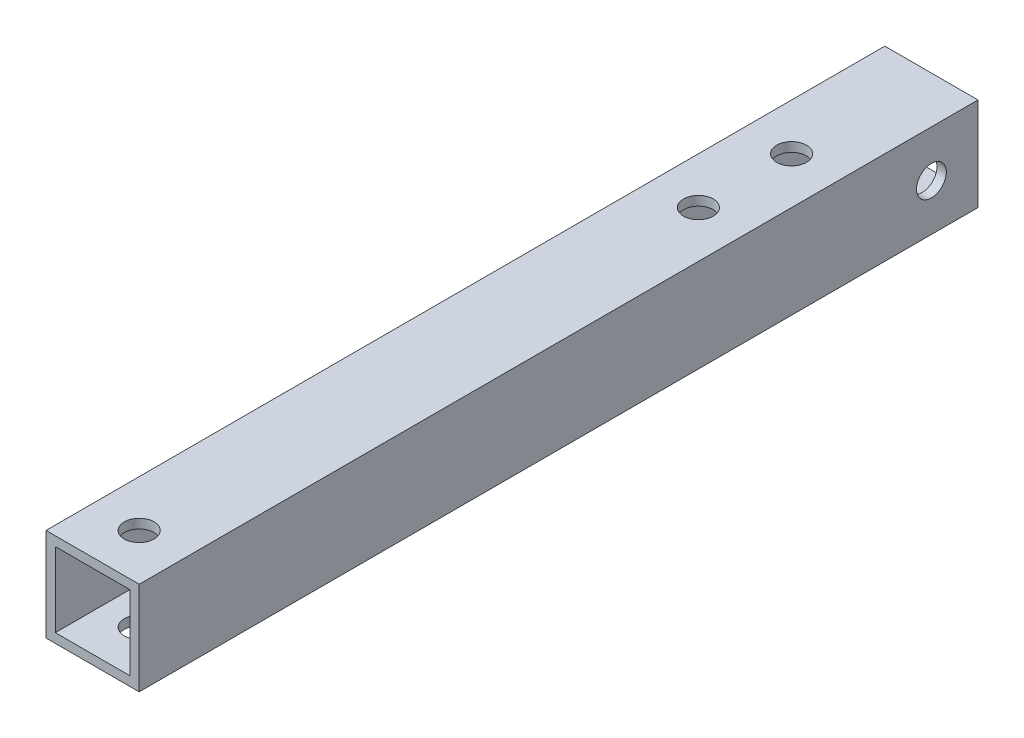
ISO-10303-21;
HEADER;
FILE_DESCRIPTION(('STEP AP214'),'2;1');
FILE_NAME('part.step','',(''),(''),'','','');
FILE_SCHEMA(('AUTOMOTIVE_DESIGN { 1 0 10303 214 1 1 1 1 }'));
ENDSEC;
DATA;
#1=APPLICATION_CONTEXT('core data for automotive mechanical design processes');
#2=APPLICATION_PROTOCOL_DEFINITION('international standard','automotive_design',2000,#1);
#3=PRODUCT_CONTEXT('',#1,'mechanical');
#4=PRODUCT('Part','Part','',(#3));
#5=PRODUCT_RELATED_PRODUCT_CATEGORY('part','',(#4));
#6=PRODUCT_DEFINITION_FORMATION('','',#4);
#7=PRODUCT_DEFINITION_CONTEXT('part definition',#1,'design');
#8=PRODUCT_DEFINITION('design','',#6,#7);
#9=PRODUCT_DEFINITION_SHAPE('','',#8);
#10=(LENGTH_UNIT() NAMED_UNIT(*) SI_UNIT(.MILLI.,.METRE.));
#11=(NAMED_UNIT(*) PLANE_ANGLE_UNIT() SI_UNIT($,.RADIAN.));
#12=(NAMED_UNIT(*) SI_UNIT($,.STERADIAN.) SOLID_ANGLE_UNIT());
#13=UNCERTAINTY_MEASURE_WITH_UNIT(LENGTH_MEASURE(1.E-05),#10,'distance_accuracy_value','');
#14=(GEOMETRIC_REPRESENTATION_CONTEXT(3) GLOBAL_UNCERTAINTY_ASSIGNED_CONTEXT((#13)) GLOBAL_UNIT_ASSIGNED_CONTEXT((#10,
#11,#12)) REPRESENTATION_CONTEXT('',''));
#15=CARTESIAN_POINT('',(0.,0.,0.));
#16=DIRECTION('',(0.,0.,1.));
#17=DIRECTION('',(1.,0.,0.));
#18=AXIS2_PLACEMENT_3D('',#15,#16,#17);
#19=CARTESIAN_POINT('',(0.,0.,90.));
#20=DIRECTION('',(0.,0.,1.));
#21=DIRECTION('',(1.,0.,0.));
#22=AXIS2_PLACEMENT_3D('',#19,#20,#21);
#23=PLANE('',#22);
#24=DIRECTION('',(0.,-1.,0.));
#25=VECTOR('',#24,1.);
#26=CARTESIAN_POINT('',(-5.,-5.,90.));
#27=LINE('',#26,#25);
#28=CARTESIAN_POINT('',(-5.,5.,90.));
#29=VERTEX_POINT('',#28);
#30=CARTESIAN_POINT('',(-5.,-5.,90.));
#31=VERTEX_POINT('',#30);
#32=EDGE_CURVE('E138',#29,#31,#27,.T.);
#33=ORIENTED_EDGE('',*,*,#32,.T.);
#34=DIRECTION('',(1.,0.,0.));
#35=VECTOR('',#34,1.);
#36=CARTESIAN_POINT('',(5.,-5.,90.));
#37=LINE('',#36,#35);
#38=CARTESIAN_POINT('',(5.,-5.,90.));
#39=VERTEX_POINT('',#38);
#40=EDGE_CURVE('E141',#31,#39,#37,.T.);
#41=ORIENTED_EDGE('',*,*,#40,.T.);
#42=DIRECTION('',(0.,1.,0.));
#43=VECTOR('',#42,1.);
#44=CARTESIAN_POINT('',(5.,-5.,90.));
#45=LINE('',#44,#43);
#46=CARTESIAN_POINT('',(5.,5.,90.));
#47=VERTEX_POINT('',#46);
#48=EDGE_CURVE('E144',#39,#47,#45,.T.);
#49=ORIENTED_EDGE('',*,*,#48,.T.);
#50=DIRECTION('',(-1.,0.,0.));
#51=VECTOR('',#50,1.);
#52=CARTESIAN_POINT('',(5.,5.,90.));
#53=LINE('',#52,#51);
#54=EDGE_CURVE('E146',#47,#29,#53,.T.);
#55=ORIENTED_EDGE('',*,*,#54,.T.);
#56=EDGE_LOOP('',(#33,#41,#49,#55));
#57=FACE_BOUND('',#56,.T.);
#58=DIRECTION('',(1.,0.,0.));
#59=VECTOR('',#58,1.);
#60=CARTESIAN_POINT('',(4.,-4.,90.));
#61=LINE('',#60,#59);
#62=CARTESIAN_POINT('',(-4.,-4.,90.));
#63=VERTEX_POINT('',#62);
#64=CARTESIAN_POINT('',(4.,-4.,90.));
#65=VERTEX_POINT('',#64);
#66=EDGE_CURVE('E108',#63,#65,#61,.T.);
#67=ORIENTED_EDGE('',*,*,#66,.F.);
#68=DIRECTION('',(0.,-1.,0.));
#69=VECTOR('',#68,1.);
#70=CARTESIAN_POINT('',(-4.,-4.,90.));
#71=LINE('',#70,#69);
#72=CARTESIAN_POINT('',(-4.,4.,90.));
#73=VERTEX_POINT('',#72);
#74=EDGE_CURVE('E100',#73,#63,#71,.T.);
#75=ORIENTED_EDGE('',*,*,#74,.F.);
#76=DIRECTION('',(-1.,0.,0.));
#77=VECTOR('',#76,1.);
#78=CARTESIAN_POINT('',(4.,4.,90.));
#79=LINE('',#78,#77);
#80=CARTESIAN_POINT('',(4.,4.,90.));
#81=VERTEX_POINT('',#80);
#82=EDGE_CURVE('E122',#81,#73,#79,.T.);
#83=ORIENTED_EDGE('',*,*,#82,.F.);
#84=DIRECTION('',(0.,1.,0.));
#85=VECTOR('',#84,1.);
#86=CARTESIAN_POINT('',(4.,-4.,90.));
#87=LINE('',#86,#85);
#88=EDGE_CURVE('E120',#65,#81,#87,.T.);
#89=ORIENTED_EDGE('',*,*,#88,.F.);
#90=EDGE_LOOP('',(#67,#75,#83,#89));
#91=FACE_BOUND('',#90,.T.);
#92=ADVANCED_FACE('F33',(#57,#91),#23,.T.);
#93=CARTESIAN_POINT('',(0.,0.,0.));
#94=DIRECTION('',(0.,0.,1.));
#95=DIRECTION('',(1.,0.,0.));
#96=AXIS2_PLACEMENT_3D('',#93,#94,#95);
#97=PLANE('',#96);
#98=DIRECTION('',(0.,-1.,0.));
#99=VECTOR('',#98,1.);
#100=CARTESIAN_POINT('',(-5.,-5.,0.));
#101=LINE('',#100,#99);
#102=CARTESIAN_POINT('',(-5.,5.,0.));
#103=VERTEX_POINT('',#102);
#104=CARTESIAN_POINT('',(-5.,-5.,0.));
#105=VERTEX_POINT('',#104);
#106=EDGE_CURVE('E116',#103,#105,#101,.T.);
#107=ORIENTED_EDGE('',*,*,#106,.F.);
#108=DIRECTION('',(-1.,0.,0.));
#109=VECTOR('',#108,1.);
#110=CARTESIAN_POINT('',(5.,5.,0.));
#111=LINE('',#110,#109);
#112=CARTESIAN_POINT('',(5.,5.,0.));
#113=VERTEX_POINT('',#112);
#114=EDGE_CURVE('E142',#113,#103,#111,.T.);
#115=ORIENTED_EDGE('',*,*,#114,.F.);
#116=DIRECTION('',(0.,1.,0.));
#117=VECTOR('',#116,1.);
#118=CARTESIAN_POINT('',(5.,-5.,0.));
#119=LINE('',#118,#117);
#120=CARTESIAN_POINT('',(5.,-5.,0.));
#121=VERTEX_POINT('',#120);
#122=EDGE_CURVE('E153',#121,#113,#119,.T.);
#123=ORIENTED_EDGE('',*,*,#122,.F.);
#124=DIRECTION('',(1.,0.,0.));
#125=VECTOR('',#124,1.);
#126=CARTESIAN_POINT('',(5.,-5.,0.));
#127=LINE('',#126,#125);
#128=EDGE_CURVE('E151',#105,#121,#127,.T.);
#129=ORIENTED_EDGE('',*,*,#128,.F.);
#130=EDGE_LOOP('',(#107,#115,#123,#129));
#131=FACE_BOUND('',#130,.T.);
#132=DIRECTION('',(0.,-1.,0.));
#133=VECTOR('',#132,1.);
#134=CARTESIAN_POINT('',(-4.,-4.,0.));
#135=LINE('',#134,#133);
#136=CARTESIAN_POINT('',(-4.,4.,0.));
#137=VERTEX_POINT('',#136);
#138=CARTESIAN_POINT('',(-4.,-4.,0.));
#139=VERTEX_POINT('',#138);
#140=EDGE_CURVE('E58',#137,#139,#135,.T.);
#141=ORIENTED_EDGE('',*,*,#140,.T.);
#142=DIRECTION('',(1.,0.,0.));
#143=VECTOR('',#142,1.);
#144=CARTESIAN_POINT('',(4.,-4.,0.));
#145=LINE('',#144,#143);
#146=CARTESIAN_POINT('',(4.,-4.,0.));
#147=VERTEX_POINT('',#146);
#148=EDGE_CURVE('E115',#139,#147,#145,.T.);
#149=ORIENTED_EDGE('',*,*,#148,.T.);
#150=DIRECTION('',(0.,1.,0.));
#151=VECTOR('',#150,1.);
#152=CARTESIAN_POINT('',(4.,-4.,0.));
#153=LINE('',#152,#151);
#154=CARTESIAN_POINT('',(4.,4.,0.));
#155=VERTEX_POINT('',#154);
#156=EDGE_CURVE('E130',#147,#155,#153,.T.);
#157=ORIENTED_EDGE('',*,*,#156,.T.);
#158=DIRECTION('',(-1.,0.,0.));
#159=VECTOR('',#158,1.);
#160=CARTESIAN_POINT('',(4.,4.,0.));
#161=LINE('',#160,#159);
#162=EDGE_CURVE('E109',#155,#137,#161,.T.);
#163=ORIENTED_EDGE('',*,*,#162,.T.);
#164=EDGE_LOOP('',(#141,#149,#157,#163));
#165=FACE_BOUND('',#164,.T.);
#166=ADVANCED_FACE('F222',(#131,#165),#97,.F.);
#167=CARTESIAN_POINT('',(-5.,-5.,90.));
#168=DIRECTION('',(1.,0.,0.));
#169=DIRECTION('',(0.,0.,-1.));
#170=AXIS2_PLACEMENT_3D('',#167,#168,#169);
#171=PLANE('',#170);
#172=CARTESIAN_POINT('',(-5.,0.,5.));
#173=DIRECTION('',(1.,0.,0.));
#174=DIRECTION('',(0.,0.,-1.));
#175=AXIS2_PLACEMENT_3D('',#172,#173,#174);
#176=CIRCLE('',#175,1.6);
#177=CARTESIAN_POINT('',(-5.,0.,3.4));
#178=VERTEX_POINT('',#177);
#179=EDGE_CURVE('E187',#178,#178,#176,.T.);
#180=ORIENTED_EDGE('',*,*,#179,.T.);
#181=EDGE_LOOP('',(#180));
#182=FACE_BOUND('',#181,.T.);
#183=ORIENTED_EDGE('',*,*,#106,.T.);
#184=DIRECTION('',(0.,0.,-1.));
#185=VECTOR('',#184,1.);
#186=CARTESIAN_POINT('',(-5.,-5.,90.));
#187=LINE('',#186,#185);
#188=EDGE_CURVE('E11',#31,#105,#187,.T.);
#189=ORIENTED_EDGE('',*,*,#188,.F.);
#190=ORIENTED_EDGE('',*,*,#32,.F.);
#191=DIRECTION('',(0.,0.,-1.));
#192=VECTOR('',#191,1.);
#193=CARTESIAN_POINT('',(-5.,5.,90.));
#194=LINE('',#193,#192);
#195=EDGE_CURVE('E148',#29,#103,#194,.T.);
#196=ORIENTED_EDGE('',*,*,#195,.T.);
#197=EDGE_LOOP('',(#183,#189,#190,#196));
#198=FACE_BOUND('',#197,.T.);
#199=ADVANCED_FACE('F35',(#182,#198),#171,.F.);
#200=CARTESIAN_POINT('',(5.,-5.,90.));
#201=DIRECTION('',(0.,1.,0.));
#202=DIRECTION('',(0.,0.,1.));
#203=AXIS2_PLACEMENT_3D('',#200,#201,#202);
#204=PLANE('',#203);
#205=CARTESIAN_POINT('',(0.,-5.,15.));
#206=DIRECTION('',(0.,1.,0.));
#207=DIRECTION('',(-1.,0.,0.));
#208=AXIS2_PLACEMENT_3D('',#205,#206,#207);
#209=CIRCLE('',#208,1.6);
#210=CARTESIAN_POINT('',(-1.6,-5.,15.));
#211=VERTEX_POINT('',#210);
#212=EDGE_CURVE('E167',#211,#211,#209,.T.);
#213=ORIENTED_EDGE('',*,*,#212,.T.);
#214=EDGE_LOOP('',(#213));
#215=FACE_BOUND('',#214,.T.);
#216=CARTESIAN_POINT('',(0.,-5.,85.));
#217=DIRECTION('',(0.,1.,0.));
#218=DIRECTION('',(-1.,0.,0.));
#219=AXIS2_PLACEMENT_3D('',#216,#217,#218);
#220=CIRCLE('',#219,1.6);
#221=CARTESIAN_POINT('',(-1.6,-5.,85.));
#222=VERTEX_POINT('',#221);
#223=EDGE_CURVE('E193',#222,#222,#220,.T.);
#224=ORIENTED_EDGE('',*,*,#223,.T.);
#225=EDGE_LOOP('',(#224));
#226=FACE_BOUND('',#225,.T.);
#227=CARTESIAN_POINT('',(0.,-5.,25.));
#228=DIRECTION('',(0.,1.,0.));
#229=DIRECTION('',(-1.,0.,0.));
#230=AXIS2_PLACEMENT_3D('',#227,#228,#229);
#231=CIRCLE('',#230,1.6);
#232=CARTESIAN_POINT('',(-1.6,-5.,25.));
#233=VERTEX_POINT('',#232);
#234=EDGE_CURVE('E186',#233,#233,#231,.T.);
#235=ORIENTED_EDGE('',*,*,#234,.T.);
#236=EDGE_LOOP('',(#235));
#237=FACE_BOUND('',#236,.T.);
#238=ORIENTED_EDGE('',*,*,#128,.T.);
#239=DIRECTION('',(0.,0.,-1.));
#240=VECTOR('',#239,1.);
#241=CARTESIAN_POINT('',(5.,-5.,90.));
#242=LINE('',#241,#240);
#243=EDGE_CURVE('E42',#39,#121,#242,.T.);
#244=ORIENTED_EDGE('',*,*,#243,.F.);
#245=ORIENTED_EDGE('',*,*,#40,.F.);
#246=ORIENTED_EDGE('',*,*,#188,.T.);
#247=EDGE_LOOP('',(#238,#244,#245,#246));
#248=FACE_BOUND('',#247,.T.);
#249=ADVANCED_FACE('F252',(#215,#226,#237,#248),#204,.F.);
#250=CARTESIAN_POINT('',(5.,-5.,90.));
#251=DIRECTION('',(-1.,0.,0.));
#252=DIRECTION('',(0.,0.,1.));
#253=AXIS2_PLACEMENT_3D('',#250,#251,#252);
#254=PLANE('',#253);
#255=CARTESIAN_POINT('',(5.,0.,5.));
#256=DIRECTION('',(1.,0.,0.));
#257=DIRECTION('',(0.,0.,-1.));
#258=AXIS2_PLACEMENT_3D('',#255,#256,#257);
#259=CIRCLE('',#258,1.6);
#260=CARTESIAN_POINT('',(5.,0.,3.4));
#261=VERTEX_POINT('',#260);
#262=EDGE_CURVE('E206',#261,#261,#259,.T.);
#263=ORIENTED_EDGE('',*,*,#262,.F.);
#264=EDGE_LOOP('',(#263));
#265=FACE_BOUND('',#264,.T.);
#266=ORIENTED_EDGE('',*,*,#122,.T.);
#267=DIRECTION('',(0.,0.,-1.));
#268=VECTOR('',#267,1.);
#269=CARTESIAN_POINT('',(5.,5.,90.));
#270=LINE('',#269,#268);
#271=EDGE_CURVE('E158',#47,#113,#270,.T.);
#272=ORIENTED_EDGE('',*,*,#271,.F.);
#273=ORIENTED_EDGE('',*,*,#48,.F.);
#274=ORIENTED_EDGE('',*,*,#243,.T.);
#275=EDGE_LOOP('',(#266,#272,#273,#274));
#276=FACE_BOUND('',#275,.T.);
#277=ADVANCED_FACE('F249',(#265,#276),#254,.F.);
#278=CARTESIAN_POINT('',(5.,5.,90.));
#279=DIRECTION('',(0.,-1.,0.));
#280=DIRECTION('',(1.,0.,0.));
#281=AXIS2_PLACEMENT_3D('',#278,#279,#280);
#282=PLANE('',#281);
#283=CARTESIAN_POINT('',(0.,5.,15.));
#284=DIRECTION('',(0.,1.,0.));
#285=DIRECTION('',(-1.,0.,0.));
#286=AXIS2_PLACEMENT_3D('',#283,#284,#285);
#287=CIRCLE('',#286,1.6);
#288=CARTESIAN_POINT('',(-1.6,5.,15.));
#289=VERTEX_POINT('',#288);
#290=EDGE_CURVE('E196',#289,#289,#287,.T.);
#291=ORIENTED_EDGE('',*,*,#290,.F.);
#292=EDGE_LOOP('',(#291));
#293=FACE_BOUND('',#292,.T.);
#294=CARTESIAN_POINT('',(0.,5.,85.));
#295=DIRECTION('',(0.,1.,0.));
#296=DIRECTION('',(-1.,0.,0.));
#297=AXIS2_PLACEMENT_3D('',#294,#295,#296);
#298=CIRCLE('',#297,1.6);
#299=CARTESIAN_POINT('',(-1.6,5.,85.));
#300=VERTEX_POINT('',#299);
#301=EDGE_CURVE('E190',#300,#300,#298,.T.);
#302=ORIENTED_EDGE('',*,*,#301,.F.);
#303=EDGE_LOOP('',(#302));
#304=FACE_BOUND('',#303,.T.);
#305=CARTESIAN_POINT('',(0.,5.,25.));
#306=DIRECTION('',(0.,1.,0.));
#307=DIRECTION('',(-1.,0.,0.));
#308=AXIS2_PLACEMENT_3D('',#305,#306,#307);
#309=CIRCLE('',#308,1.6);
#310=CARTESIAN_POINT('',(-1.6,5.,25.));
#311=VERTEX_POINT('',#310);
#312=EDGE_CURVE('E183',#311,#311,#309,.T.);
#313=ORIENTED_EDGE('',*,*,#312,.F.);
#314=EDGE_LOOP('',(#313));
#315=FACE_BOUND('',#314,.T.);
#316=ORIENTED_EDGE('',*,*,#114,.T.);
#317=ORIENTED_EDGE('',*,*,#195,.F.);
#318=ORIENTED_EDGE('',*,*,#54,.F.);
#319=ORIENTED_EDGE('',*,*,#271,.T.);
#320=EDGE_LOOP('',(#316,#317,#318,#319));
#321=FACE_BOUND('',#320,.T.);
#322=ADVANCED_FACE('F246',(#293,#304,#315,#321),#282,.F.);
#323=CARTESIAN_POINT('',(-4.,-4.,90.));
#324=DIRECTION('',(1.,0.,0.));
#325=DIRECTION('',(0.,0.,-1.));
#326=AXIS2_PLACEMENT_3D('',#323,#324,#325);
#327=PLANE('',#326);
#328=CARTESIAN_POINT('',(-4.,0.,5.));
#329=DIRECTION('',(1.,0.,0.));
#330=DIRECTION('',(0.,0.,-1.));
#331=AXIS2_PLACEMENT_3D('',#328,#329,#330);
#332=CIRCLE('',#331,1.6);
#333=CARTESIAN_POINT('',(-4.,0.,3.4));
#334=VERTEX_POINT('',#333);
#335=EDGE_CURVE('E203',#334,#334,#332,.T.);
#336=ORIENTED_EDGE('',*,*,#335,.F.);
#337=EDGE_LOOP('',(#336));
#338=FACE_BOUND('',#337,.T.);
#339=ORIENTED_EDGE('',*,*,#140,.F.);
#340=DIRECTION('',(0.,0.,-1.));
#341=VECTOR('',#340,1.);
#342=CARTESIAN_POINT('',(-4.,4.,90.));
#343=LINE('',#342,#341);
#344=EDGE_CURVE('E104',#73,#137,#343,.T.);
#345=ORIENTED_EDGE('',*,*,#344,.F.);
#346=ORIENTED_EDGE('',*,*,#74,.T.);
#347=DIRECTION('',(0.,0.,-1.));
#348=VECTOR('',#347,1.);
#349=CARTESIAN_POINT('',(-4.,-4.,90.));
#350=LINE('',#349,#348);
#351=EDGE_CURVE('E103',#63,#139,#350,.T.);
#352=ORIENTED_EDGE('',*,*,#351,.T.);
#353=EDGE_LOOP('',(#339,#345,#346,#352));
#354=FACE_BOUND('',#353,.T.);
#355=ADVANCED_FACE('F102',(#338,#354),#327,.T.);
#356=CARTESIAN_POINT('',(4.,-4.,90.));
#357=DIRECTION('',(0.,1.,0.));
#358=DIRECTION('',(0.,0.,1.));
#359=AXIS2_PLACEMENT_3D('',#356,#357,#358);
#360=PLANE('',#359);
#361=CARTESIAN_POINT('',(0.,-4.,15.));
#362=DIRECTION('',(0.,1.,0.));
#363=DIRECTION('',(0.,0.,1.));
#364=AXIS2_PLACEMENT_3D('',#361,#362,#363);
#365=CIRCLE('',#364,1.6);
#366=CARTESIAN_POINT('',(0.,-4.,16.6));
#367=VERTEX_POINT('',#366);
#368=EDGE_CURVE('E128',#367,#367,#365,.T.);
#369=ORIENTED_EDGE('',*,*,#368,.F.);
#370=EDGE_LOOP('',(#369));
#371=FACE_BOUND('',#370,.T.);
#372=CARTESIAN_POINT('',(0.,-4.,85.));
#373=DIRECTION('',(0.,1.,0.));
#374=DIRECTION('',(0.,0.,1.));
#375=AXIS2_PLACEMENT_3D('',#372,#373,#374);
#376=CIRCLE('',#375,1.6);
#377=CARTESIAN_POINT('',(0.,-4.,86.6));
#378=VERTEX_POINT('',#377);
#379=EDGE_CURVE('E170',#378,#378,#376,.T.);
#380=ORIENTED_EDGE('',*,*,#379,.F.);
#381=EDGE_LOOP('',(#380));
#382=FACE_BOUND('',#381,.T.);
#383=CARTESIAN_POINT('',(0.,-4.,25.));
#384=DIRECTION('',(0.,1.,0.));
#385=DIRECTION('',(0.,0.,1.));
#386=AXIS2_PLACEMENT_3D('',#383,#384,#385);
#387=CIRCLE('',#386,1.6);
#388=CARTESIAN_POINT('',(0.,-4.,26.6));
#389=VERTEX_POINT('',#388);
#390=EDGE_CURVE('E166',#389,#389,#387,.T.);
#391=ORIENTED_EDGE('',*,*,#390,.F.);
#392=EDGE_LOOP('',(#391));
#393=FACE_BOUND('',#392,.T.);
#394=ORIENTED_EDGE('',*,*,#148,.F.);
#395=ORIENTED_EDGE('',*,*,#351,.F.);
#396=ORIENTED_EDGE('',*,*,#66,.T.);
#397=DIRECTION('',(0.,0.,-1.));
#398=VECTOR('',#397,1.);
#399=CARTESIAN_POINT('',(4.,-4.,90.));
#400=LINE('',#399,#398);
#401=EDGE_CURVE('E117',#65,#147,#400,.T.);
#402=ORIENTED_EDGE('',*,*,#401,.T.);
#403=EDGE_LOOP('',(#394,#395,#396,#402));
#404=FACE_BOUND('',#403,.T.);
#405=ADVANCED_FACE('F112',(#371,#382,#393,#404),#360,.T.);
#406=CARTESIAN_POINT('',(4.,-4.,90.));
#407=DIRECTION('',(-1.,0.,0.));
#408=DIRECTION('',(0.,0.,1.));
#409=AXIS2_PLACEMENT_3D('',#406,#407,#408);
#410=PLANE('',#409);
#411=CARTESIAN_POINT('',(4.,0.,5.));
#412=DIRECTION('',(-1.,0.,0.));
#413=DIRECTION('',(0.,0.,1.));
#414=AXIS2_PLACEMENT_3D('',#411,#412,#413);
#415=CIRCLE('',#414,1.6);
#416=CARTESIAN_POINT('',(4.,0.,6.6));
#417=VERTEX_POINT('',#416);
#418=EDGE_CURVE('E37',#417,#417,#415,.T.);
#419=ORIENTED_EDGE('',*,*,#418,.F.);
#420=EDGE_LOOP('',(#419));
#421=FACE_BOUND('',#420,.T.);
#422=ORIENTED_EDGE('',*,*,#156,.F.);
#423=ORIENTED_EDGE('',*,*,#401,.F.);
#424=ORIENTED_EDGE('',*,*,#88,.T.);
#425=DIRECTION('',(0.,0.,-1.));
#426=VECTOR('',#425,1.);
#427=CARTESIAN_POINT('',(4.,4.,90.));
#428=LINE('',#427,#426);
#429=EDGE_CURVE('E50',#81,#155,#428,.T.);
#430=ORIENTED_EDGE('',*,*,#429,.T.);
#431=EDGE_LOOP('',(#422,#423,#424,#430));
#432=FACE_BOUND('',#431,.T.);
#433=ADVANCED_FACE('F215',(#421,#432),#410,.T.);
#434=CARTESIAN_POINT('',(4.,4.,90.));
#435=DIRECTION('',(0.,-1.,0.));
#436=DIRECTION('',(0.,0.,-1.));
#437=AXIS2_PLACEMENT_3D('',#434,#435,#436);
#438=PLANE('',#437);
#439=CARTESIAN_POINT('',(0.,4.,15.));
#440=DIRECTION('',(0.,-1.,0.));
#441=DIRECTION('',(0.,0.,-1.));
#442=AXIS2_PLACEMENT_3D('',#439,#440,#441);
#443=CIRCLE('',#442,1.6);
#444=CARTESIAN_POINT('',(0.,4.,13.4));
#445=VERTEX_POINT('',#444);
#446=EDGE_CURVE('E171',#445,#445,#443,.T.);
#447=ORIENTED_EDGE('',*,*,#446,.F.);
#448=EDGE_LOOP('',(#447));
#449=FACE_BOUND('',#448,.T.);
#450=CARTESIAN_POINT('',(0.,4.,85.));
#451=DIRECTION('',(0.,-1.,0.));
#452=DIRECTION('',(0.,0.,-1.));
#453=AXIS2_PLACEMENT_3D('',#450,#451,#452);
#454=CIRCLE('',#453,1.6);
#455=CARTESIAN_POINT('',(0.,4.,83.4));
#456=VERTEX_POINT('',#455);
#457=EDGE_CURVE('E168',#456,#456,#454,.T.);
#458=ORIENTED_EDGE('',*,*,#457,.F.);
#459=EDGE_LOOP('',(#458));
#460=FACE_BOUND('',#459,.T.);
#461=CARTESIAN_POINT('',(0.,4.,25.));
#462=DIRECTION('',(0.,-1.,0.));
#463=DIRECTION('',(0.,0.,-1.));
#464=AXIS2_PLACEMENT_3D('',#461,#462,#463);
#465=CIRCLE('',#464,1.6);
#466=CARTESIAN_POINT('',(0.,4.,23.4));
#467=VERTEX_POINT('',#466);
#468=EDGE_CURVE('E163',#467,#467,#465,.T.);
#469=ORIENTED_EDGE('',*,*,#468,.F.);
#470=EDGE_LOOP('',(#469));
#471=FACE_BOUND('',#470,.T.);
#472=ORIENTED_EDGE('',*,*,#162,.F.);
#473=ORIENTED_EDGE('',*,*,#429,.F.);
#474=ORIENTED_EDGE('',*,*,#82,.T.);
#475=ORIENTED_EDGE('',*,*,#344,.T.);
#476=EDGE_LOOP('',(#472,#473,#474,#475));
#477=FACE_BOUND('',#476,.T.);
#478=ADVANCED_FACE('F218',(#449,#460,#471,#477),#438,.T.);
#479=CARTESIAN_POINT('',(0.,-5.,25.));
#480=DIRECTION('',(0.,1.,0.));
#481=DIRECTION('',(-1.,0.,0.));
#482=AXIS2_PLACEMENT_3D('',#479,#480,#481);
#483=CYLINDRICAL_SURFACE('',#482,1.6);
#484=ORIENTED_EDGE('',*,*,#468,.T.);
#485=EDGE_LOOP('',(#484));
#486=FACE_BOUND('',#485,.T.);
#487=ORIENTED_EDGE('',*,*,#312,.T.);
#488=EDGE_LOOP('',(#487));
#489=FACE_BOUND('',#488,.T.);
#490=ADVANCED_FACE('F224',(#486,#489),#483,.F.);
#491=CARTESIAN_POINT('',(0.,-5.,85.));
#492=DIRECTION('',(0.,1.,0.));
#493=DIRECTION('',(-1.,0.,0.));
#494=AXIS2_PLACEMENT_3D('',#491,#492,#493);
#495=CYLINDRICAL_SURFACE('',#494,1.6);
#496=ORIENTED_EDGE('',*,*,#457,.T.);
#497=EDGE_LOOP('',(#496));
#498=FACE_BOUND('',#497,.T.);
#499=ORIENTED_EDGE('',*,*,#301,.T.);
#500=EDGE_LOOP('',(#499));
#501=FACE_BOUND('',#500,.T.);
#502=ADVANCED_FACE('F230',(#498,#501),#495,.F.);
#503=CARTESIAN_POINT('',(0.,-5.,15.));
#504=DIRECTION('',(0.,1.,0.));
#505=DIRECTION('',(-1.,0.,0.));
#506=AXIS2_PLACEMENT_3D('',#503,#504,#505);
#507=CYLINDRICAL_SURFACE('',#506,1.6);
#508=ORIENTED_EDGE('',*,*,#446,.T.);
#509=EDGE_LOOP('',(#508));
#510=FACE_BOUND('',#509,.T.);
#511=ORIENTED_EDGE('',*,*,#290,.T.);
#512=EDGE_LOOP('',(#511));
#513=FACE_BOUND('',#512,.T.);
#514=ADVANCED_FACE('F282',(#510,#513),#507,.F.);
#515=ORIENTED_EDGE('',*,*,#390,.T.);
#516=EDGE_LOOP('',(#515));
#517=FACE_BOUND('',#516,.T.);
#518=ORIENTED_EDGE('',*,*,#234,.F.);
#519=EDGE_LOOP('',(#518));
#520=FACE_BOUND('',#519,.T.);
#521=ADVANCED_FACE('F233',(#517,#520),#483,.F.);
#522=ORIENTED_EDGE('',*,*,#379,.T.);
#523=EDGE_LOOP('',(#522));
#524=FACE_BOUND('',#523,.T.);
#525=ORIENTED_EDGE('',*,*,#223,.F.);
#526=EDGE_LOOP('',(#525));
#527=FACE_BOUND('',#526,.T.);
#528=ADVANCED_FACE('F281',(#524,#527),#495,.F.);
#529=ORIENTED_EDGE('',*,*,#368,.T.);
#530=EDGE_LOOP('',(#529));
#531=FACE_BOUND('',#530,.T.);
#532=ORIENTED_EDGE('',*,*,#212,.F.);
#533=EDGE_LOOP('',(#532));
#534=FACE_BOUND('',#533,.T.);
#535=ADVANCED_FACE('F288',(#531,#534),#507,.F.);
#536=CARTESIAN_POINT('',(-55.,0.,5.));
#537=DIRECTION('',(1.,0.,0.));
#538=DIRECTION('',(0.,0.,-1.));
#539=AXIS2_PLACEMENT_3D('',#536,#537,#538);
#540=CYLINDRICAL_SURFACE('',#539,1.6);
#541=ORIENTED_EDGE('',*,*,#418,.T.);
#542=EDGE_LOOP('',(#541));
#543=FACE_BOUND('',#542,.T.);
#544=ORIENTED_EDGE('',*,*,#262,.T.);
#545=EDGE_LOOP('',(#544));
#546=FACE_BOUND('',#545,.T.);
#547=ADVANCED_FACE('F213',(#543,#546),#540,.F.);
#548=CARTESIAN_POINT('',(-4.,0.,3.4));
#549=CARTESIAN_POINT('',(-4.01041666666667,0.,3.4));
#550=CARTESIAN_POINT('',(-4.02083333333333,0.,3.4));
#551=CARTESIAN_POINT('',(-4.04166666666667,0.,3.4));
#552=CARTESIAN_POINT('',(-4.05208333333334,0.,3.4));
#553=CARTESIAN_POINT('',(-4.07291666666667,0.,3.4));
#554=CARTESIAN_POINT('',(-4.08333333333334,0.,3.4));
#555=CARTESIAN_POINT('',(-4.10416666666667,0.,3.4));
#556=CARTESIAN_POINT('',(-4.11458333333334,0.,3.4));
#557=CARTESIAN_POINT('',(-4.13541666666667,0.,3.4));
#558=CARTESIAN_POINT('',(-4.14583333333333,0.,3.4));
#559=CARTESIAN_POINT('',(-4.16666666666667,0.,3.4));
#560=CARTESIAN_POINT('',(-4.17708333333334,0.,3.4));
#561=CARTESIAN_POINT('',(-4.19791666666667,0.,3.4));
#562=CARTESIAN_POINT('',(-4.20833333333334,0.,3.4));
#563=CARTESIAN_POINT('',(-4.22916666666667,0.,3.4));
#564=CARTESIAN_POINT('',(-4.23958333333334,0.,3.4));
#565=CARTESIAN_POINT('',(-4.26041666666667,0.,3.4));
#566=CARTESIAN_POINT('',(-4.27083333333333,0.,3.4));
#567=CARTESIAN_POINT('',(-4.29166666666667,0.,3.4));
#568=CARTESIAN_POINT('',(-4.30208333333334,0.,3.4));
#569=CARTESIAN_POINT('',(-4.32291666666667,0.,3.4));
#570=CARTESIAN_POINT('',(-4.33333333333334,0.,3.4));
#571=CARTESIAN_POINT('',(-4.35416666666667,0.,3.4));
#572=CARTESIAN_POINT('',(-4.36458333333334,0.,3.4));
#573=CARTESIAN_POINT('',(-4.38541666666667,0.,3.4));
#574=CARTESIAN_POINT('',(-4.39583333333333,0.,3.4));
#575=CARTESIAN_POINT('',(-4.41666666666667,0.,3.4));
#576=CARTESIAN_POINT('',(-4.42708333333334,0.,3.4));
#577=CARTESIAN_POINT('',(-4.44791666666667,0.,3.4));
#578=CARTESIAN_POINT('',(-4.45833333333334,0.,3.4));
#579=CARTESIAN_POINT('',(-4.47916666666667,0.,3.4));
#580=CARTESIAN_POINT('',(-4.48958333333334,0.,3.4));
#581=CARTESIAN_POINT('',(-4.51041666666667,0.,3.4));
#582=CARTESIAN_POINT('',(-4.52083333333333,0.,3.4));
#583=CARTESIAN_POINT('',(-4.54166666666667,0.,3.4));
#584=CARTESIAN_POINT('',(-4.55208333333334,0.,3.4));
#585=CARTESIAN_POINT('',(-4.57291666666667,0.,3.4));
#586=CARTESIAN_POINT('',(-4.58333333333334,0.,3.4));
#587=CARTESIAN_POINT('',(-4.60416666666667,0.,3.4));
#588=CARTESIAN_POINT('',(-4.61458333333334,0.,3.4));
#589=CARTESIAN_POINT('',(-4.63541666666667,0.,3.4));
#590=CARTESIAN_POINT('',(-4.64583333333333,0.,3.4));
#591=CARTESIAN_POINT('',(-4.66666666666667,0.,3.4));
#592=CARTESIAN_POINT('',(-4.67708333333334,0.,3.4));
#593=CARTESIAN_POINT('',(-4.69791666666667,0.,3.4));
#594=CARTESIAN_POINT('',(-4.70833333333334,0.,3.4));
#595=CARTESIAN_POINT('',(-4.72916666666667,0.,3.4));
#596=CARTESIAN_POINT('',(-4.73958333333334,0.,3.4));
#597=CARTESIAN_POINT('',(-4.76041666666667,0.,3.4));
#598=CARTESIAN_POINT('',(-4.77083333333334,0.,3.4));
#599=CARTESIAN_POINT('',(-4.79166666666667,0.,3.4));
#600=CARTESIAN_POINT('',(-4.80208333333334,0.,3.4));
#601=CARTESIAN_POINT('',(-4.82291666666667,0.,3.4));
#602=CARTESIAN_POINT('',(-4.83333333333334,0.,3.4));
#603=CARTESIAN_POINT('',(-4.85416666666667,0.,3.4));
#604=CARTESIAN_POINT('',(-4.86458333333334,0.,3.4));
#605=CARTESIAN_POINT('',(-4.88541666666667,0.,3.4));
#606=CARTESIAN_POINT('',(-4.89583333333334,0.,3.4));
#607=CARTESIAN_POINT('',(-4.91666666666667,0.,3.4));
#608=CARTESIAN_POINT('',(-4.92708333333334,0.,3.4));
#609=CARTESIAN_POINT('',(-4.94791666666667,0.,3.4));
#610=CARTESIAN_POINT('',(-4.95833333333334,0.,3.4));
#611=CARTESIAN_POINT('',(-4.97916666666667,0.,3.4));
#612=CARTESIAN_POINT('',(-4.98958333333334,0.,3.4));
#613=CARTESIAN_POINT('',(-5.,0.,3.4));
#614=B_SPLINE_CURVE_WITH_KNOTS('',3,(#548,#549,#550,#551,#552,#553,#554,#555,#556,#557,#558,
#559,#560,#561,#562,#563,#564,#565,#566,#567,#568,#569,#570,#571,#572,#573,#574,#575,#576,#577,
#578,#579,#580,#581,#582,#583,#584,#585,#586,#587,#588,#589,#590,#591,#592,#593,#594,#595,#596,
#597,#598,#599,#600,#601,#602,#603,#604,#605,#606,#607,#608,#609,#610,#611,#612,#613),
.UNSPECIFIED.,.F.,.F.,(4,2,2,2,2,2,2,2,2,2,2,2,2,2,2,2,2,2,2,2,2,2,2,2,2,2,2,2,2,2,2,2,4),(0.,
0.0312499999999966,0.0625000000000001,0.0937500000000036,0.125,0.156249999999997,0.1875,
0.218750000000004,0.25,0.281249999999997,0.3125,0.343750000000004,0.375,0.406249999999997,
0.4375,0.468750000000004,0.5,0.531249999999997,0.5625,0.593750000000004,0.625000000000001,
0.656249999999997,0.687500000000001,0.718750000000004,0.750000000000001,0.781249999999997,
0.812500000000001,0.843750000000004,0.875000000000001,0.906249999999997,0.937500000000001,
0.968750000000004,1.),.UNSPECIFIED.);
#615=EDGE_CURVE('BSEAM295',#334,#178,#614,.T.);
#616=ORIENTED_EDGE('',*,*,#335,.T.);
#617=ORIENTED_EDGE('',*,*,#179,.F.);
#618=ORIENTED_EDGE('',*,*,#615,.T.);
#619=ORIENTED_EDGE('',*,*,#615,.F.);
#620=EDGE_LOOP('',(#616,#618,#617,#619));
#621=FACE_BOUND('',#620,.T.);
#622=ADVANCED_FACE('F295',(#621),#540,.F.);
#623=CLOSED_SHELL('',(#92,#166,#199,#249,#277,#322,#355,#405,#433,#478,#490,#502,#514,#521,#528,
#535,#547,#622));
#624=MANIFOLD_SOLID_BREP('B2',#623);
#625=ADVANCED_BREP_SHAPE_REPRESENTATION('',(#18,#624),#14);
#626=SHAPE_DEFINITION_REPRESENTATION(#9,#625);
ENDSEC;
END-ISO-10303-21;
